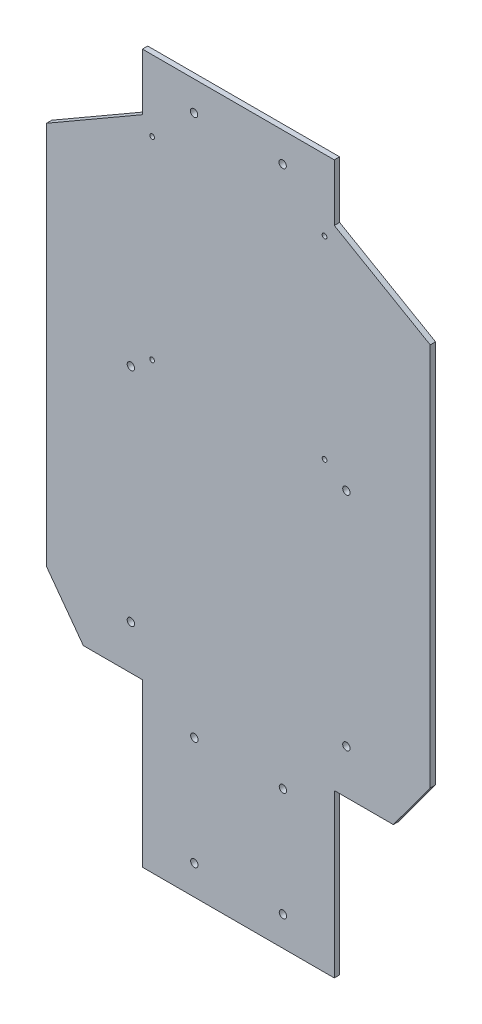
ISO-10303-21;
HEADER;
FILE_DESCRIPTION(('STEP AP214'),'2;1');
FILE_NAME('part.step','',(''),(''),'','','');
FILE_SCHEMA(('AUTOMOTIVE_DESIGN { 1 0 10303 214 1 1 1 1 }'));
ENDSEC;
DATA;
#1=APPLICATION_CONTEXT('core data for automotive mechanical design processes');
#2=APPLICATION_PROTOCOL_DEFINITION('international standard','automotive_design',2000,#1);
#3=PRODUCT_CONTEXT('',#1,'mechanical');
#4=PRODUCT('Part','Part','',(#3));
#5=PRODUCT_RELATED_PRODUCT_CATEGORY('part','',(#4));
#6=PRODUCT_DEFINITION_FORMATION('','',#4);
#7=PRODUCT_DEFINITION_CONTEXT('part definition',#1,'design');
#8=PRODUCT_DEFINITION('design','',#6,#7);
#9=PRODUCT_DEFINITION_SHAPE('','',#8);
#10=(LENGTH_UNIT() NAMED_UNIT(*) SI_UNIT(.MILLI.,.METRE.));
#11=(NAMED_UNIT(*) PLANE_ANGLE_UNIT() SI_UNIT($,.RADIAN.));
#12=(NAMED_UNIT(*) SI_UNIT($,.STERADIAN.) SOLID_ANGLE_UNIT());
#13=UNCERTAINTY_MEASURE_WITH_UNIT(LENGTH_MEASURE(1.E-05),#10,'distance_accuracy_value','');
#14=(GEOMETRIC_REPRESENTATION_CONTEXT(3) GLOBAL_UNCERTAINTY_ASSIGNED_CONTEXT((#13)) GLOBAL_UNIT_ASSIGNED_CONTEXT((#10,
#11,#12)) REPRESENTATION_CONTEXT('',''));
#15=CARTESIAN_POINT('',(0.,0.,0.));
#16=DIRECTION('',(0.,0.,1.));
#17=DIRECTION('',(1.,0.,0.));
#18=AXIS2_PLACEMENT_3D('',#15,#16,#17);
#19=CARTESIAN_POINT('',(-53.975,-171.972117639198,2.286));
#20=DIRECTION('',(-1.,0.,0.));
#21=DIRECTION('',(0.,-1.,0.));
#22=AXIS2_PLACEMENT_3D('',#19,#20,#21);
#23=PLANE('',#22);
#24=DIRECTION('',(0.,1.,0.));
#25=VECTOR('',#24,1.);
#26=CARTESIAN_POINT('',(-53.975,-171.972117639198,0.));
#27=LINE('',#26,#25);
#28=CARTESIAN_POINT('',(-53.975,-171.972117639198,0.));
#29=VERTEX_POINT('',#28);
#30=CARTESIAN_POINT('',(-53.975,-102.122117639198,0.));
#31=VERTEX_POINT('',#30);
#32=EDGE_CURVE('E169',#29,#31,#27,.T.);
#33=ORIENTED_EDGE('',*,*,#32,.F.);
#34=DIRECTION('',(0.,0.,-1.));
#35=VECTOR('',#34,1.);
#36=CARTESIAN_POINT('',(-53.975,-171.972117639198,2.286));
#37=LINE('',#36,#35);
#38=CARTESIAN_POINT('',(-53.975,-171.972117639198,2.286));
#39=VERTEX_POINT('',#38);
#40=EDGE_CURVE('E11',#39,#29,#37,.T.);
#41=ORIENTED_EDGE('',*,*,#40,.F.);
#42=DIRECTION('',(0.,1.,0.));
#43=VECTOR('',#42,1.);
#44=CARTESIAN_POINT('',(-53.975,-171.972117639198,2.286));
#45=LINE('',#44,#43);
#46=CARTESIAN_POINT('',(-53.975,-102.122117639198,2.286));
#47=VERTEX_POINT('',#46);
#48=EDGE_CURVE('E205',#39,#47,#45,.T.);
#49=ORIENTED_EDGE('',*,*,#48,.T.);
#50=DIRECTION('',(0.,0.,-1.));
#51=VECTOR('',#50,1.);
#52=CARTESIAN_POINT('',(-53.975,-102.122117639198,2.286));
#53=LINE('',#52,#51);
#54=EDGE_CURVE('E38',#47,#31,#53,.T.);
#55=ORIENTED_EDGE('',*,*,#54,.T.);
#56=EDGE_LOOP('',(#33,#41,#49,#55));
#57=FACE_BOUND('',#56,.T.);
#58=ADVANCED_FACE('F35',(#57),#23,.T.);
#59=CARTESIAN_POINT('',(-53.975,-171.972117639198,2.286));
#60=DIRECTION('',(0.,1.,0.));
#61=DIRECTION('',(0.,0.,1.));
#62=AXIS2_PLACEMENT_3D('',#59,#60,#61);
#63=PLANE('',#62);
#64=DIRECTION('',(1.,0.,0.));
#65=VECTOR('',#64,1.);
#66=CARTESIAN_POINT('',(-53.975,-171.972117639198,0.));
#67=LINE('',#66,#65);
#68=CARTESIAN_POINT('',(28.5749999999999,-171.972117639198,0.));
#69=VERTEX_POINT('',#68);
#70=EDGE_CURVE('E98',#29,#69,#67,.T.);
#71=ORIENTED_EDGE('',*,*,#70,.T.);
#72=DIRECTION('',(0.,0.,-1.));
#73=VECTOR('',#72,1.);
#74=CARTESIAN_POINT('',(28.5749999999999,-171.972117639198,2.286));
#75=LINE('',#74,#73);
#76=CARTESIAN_POINT('',(28.5749999999999,-171.972117639198,2.286));
#77=VERTEX_POINT('',#76);
#78=EDGE_CURVE('E44',#77,#69,#75,.T.);
#79=ORIENTED_EDGE('',*,*,#78,.F.);
#80=DIRECTION('',(1.,0.,0.));
#81=VECTOR('',#80,1.);
#82=CARTESIAN_POINT('',(-53.975,-171.972117639198,2.286));
#83=LINE('',#82,#81);
#84=EDGE_CURVE('E147',#39,#77,#83,.T.);
#85=ORIENTED_EDGE('',*,*,#84,.F.);
#86=ORIENTED_EDGE('',*,*,#40,.T.);
#87=EDGE_LOOP('',(#71,#79,#85,#86));
#88=FACE_BOUND('',#87,.T.);
#89=ADVANCED_FACE('F387',(#88),#63,.F.);
#90=CARTESIAN_POINT('',(28.5749999999999,-171.972117639198,2.286));
#91=DIRECTION('',(-1.,0.,0.));
#92=DIRECTION('',(0.,-1.,0.));
#93=AXIS2_PLACEMENT_3D('',#90,#91,#92);
#94=PLANE('',#93);
#95=DIRECTION('',(0.,1.,0.));
#96=VECTOR('',#95,1.);
#97=CARTESIAN_POINT('',(28.5749999999999,-171.972117639198,0.));
#98=LINE('',#97,#96);
#99=CARTESIAN_POINT('',(28.5749999999999,-102.122117639198,0.));
#100=VERTEX_POINT('',#99);
#101=EDGE_CURVE('E154',#69,#100,#98,.T.);
#102=ORIENTED_EDGE('',*,*,#101,.T.);
#103=DIRECTION('',(0.,0.,-1.));
#104=VECTOR('',#103,1.);
#105=CARTESIAN_POINT('',(28.5749999999999,-102.122117639198,2.286));
#106=LINE('',#105,#104);
#107=CARTESIAN_POINT('',(28.5749999999999,-102.122117639198,2.286));
#108=VERTEX_POINT('',#107);
#109=EDGE_CURVE('E151',#108,#100,#106,.T.);
#110=ORIENTED_EDGE('',*,*,#109,.F.);
#111=DIRECTION('',(0.,1.,0.));
#112=VECTOR('',#111,1.);
#113=CARTESIAN_POINT('',(28.5749999999999,-171.972117639198,2.286));
#114=LINE('',#113,#112);
#115=EDGE_CURVE('E140',#77,#108,#114,.T.);
#116=ORIENTED_EDGE('',*,*,#115,.F.);
#117=ORIENTED_EDGE('',*,*,#78,.T.);
#118=EDGE_LOOP('',(#102,#110,#116,#117));
#119=FACE_BOUND('',#118,.T.);
#120=ADVANCED_FACE('F152',(#119),#94,.F.);
#121=CARTESIAN_POINT('',(28.5749999999999,-102.122117639198,2.286));
#122=DIRECTION('',(0.,1.,0.));
#123=DIRECTION('',(0.,0.,1.));
#124=AXIS2_PLACEMENT_3D('',#121,#122,#123);
#125=PLANE('',#124);
#126=DIRECTION('',(1.,0.,0.));
#127=VECTOR('',#126,1.);
#128=CARTESIAN_POINT('',(28.5749999999999,-102.122117639198,0.));
#129=LINE('',#128,#127);
#130=CARTESIAN_POINT('',(53.9749999999999,-102.122117639198,0.));
#131=VERTEX_POINT('',#130);
#132=EDGE_CURVE('E202',#100,#131,#129,.T.);
#133=ORIENTED_EDGE('',*,*,#132,.T.);
#134=DIRECTION('',(0.,0.,-1.));
#135=VECTOR('',#134,1.);
#136=CARTESIAN_POINT('',(53.9749999999999,-102.122117639198,2.286));
#137=LINE('',#136,#135);
#138=CARTESIAN_POINT('',(53.9749999999999,-102.122117639198,2.286));
#139=VERTEX_POINT('',#138);
#140=EDGE_CURVE('E157',#139,#131,#137,.T.);
#141=ORIENTED_EDGE('',*,*,#140,.F.);
#142=DIRECTION('',(1.,0.,0.));
#143=VECTOR('',#142,1.);
#144=CARTESIAN_POINT('',(28.5749999999999,-102.122117639198,2.286));
#145=LINE('',#144,#143);
#146=EDGE_CURVE('E145',#108,#139,#145,.T.);
#147=ORIENTED_EDGE('',*,*,#146,.F.);
#148=ORIENTED_EDGE('',*,*,#109,.T.);
#149=EDGE_LOOP('',(#133,#141,#147,#148));
#150=FACE_BOUND('',#149,.T.);
#151=ADVANCED_FACE('F159',(#150),#125,.F.);
#152=CARTESIAN_POINT('',(53.9749999999999,-102.122117639198,2.286));
#153=DIRECTION('',(-0.805419930565665,0.59270459374599,0.));
#154=DIRECTION('',(-0.59270459374599,-0.805419930565666,0.));
#155=AXIS2_PLACEMENT_3D('',#152,#153,#154);
#156=PLANE('',#155);
#157=DIRECTION('',(0.59270459374599,0.805419930565665,0.));
#158=VECTOR('',#157,1.);
#159=CARTESIAN_POINT('',(53.9749999999999,-102.122117639198,0.));
#160=LINE('',#159,#158);
#161=CARTESIAN_POINT('',(69.85,-80.5497500000001,0.));
#162=VERTEX_POINT('',#161);
#163=EDGE_CURVE('E199',#131,#162,#160,.T.);
#164=ORIENTED_EDGE('',*,*,#163,.T.);
#165=DIRECTION('',(0.,0.,-1.));
#166=VECTOR('',#165,1.);
#167=CARTESIAN_POINT('',(69.85,-80.5497500000001,2.286));
#168=LINE('',#167,#166);
#169=CARTESIAN_POINT('',(69.85,-80.5497500000001,2.286));
#170=VERTEX_POINT('',#169);
#171=EDGE_CURVE('E209',#170,#162,#168,.T.);
#172=ORIENTED_EDGE('',*,*,#171,.F.);
#173=DIRECTION('',(0.59270459374599,0.805419930565665,0.));
#174=VECTOR('',#173,1.);
#175=CARTESIAN_POINT('',(53.9749999999999,-102.122117639198,2.286));
#176=LINE('',#175,#174);
#177=EDGE_CURVE('E162',#139,#170,#176,.T.);
#178=ORIENTED_EDGE('',*,*,#177,.F.);
#179=ORIENTED_EDGE('',*,*,#140,.T.);
#180=EDGE_LOOP('',(#164,#172,#178,#179));
#181=FACE_BOUND('',#180,.T.);
#182=ADVANCED_FACE('F233',(#181),#156,.F.);
#183=CARTESIAN_POINT('',(69.85,84.5502499999999,2.286));
#184=DIRECTION('',(1.,0.,0.));
#185=DIRECTION('',(0.,0.,-1.));
#186=AXIS2_PLACEMENT_3D('',#183,#184,#185);
#187=PLANE('',#186);
#188=DIRECTION('',(0.,-1.,0.));
#189=VECTOR('',#188,1.);
#190=CARTESIAN_POINT('',(69.85,84.5502499999999,0.));
#191=LINE('',#190,#189);
#192=CARTESIAN_POINT('',(69.85,84.5502499999999,0.));
#193=VERTEX_POINT('',#192);
#194=EDGE_CURVE('E196',#193,#162,#191,.T.);
#195=ORIENTED_EDGE('',*,*,#194,.F.);
#196=DIRECTION('',(0.,0.,-1.));
#197=VECTOR('',#196,1.);
#198=CARTESIAN_POINT('',(69.85,84.5502499999999,2.286));
#199=LINE('',#198,#197);
#200=CARTESIAN_POINT('',(69.85,84.5502499999999,2.286));
#201=VERTEX_POINT('',#200);
#202=EDGE_CURVE('E211',#201,#193,#199,.T.);
#203=ORIENTED_EDGE('',*,*,#202,.F.);
#204=DIRECTION('',(0.,-1.,0.));
#205=VECTOR('',#204,1.);
#206=CARTESIAN_POINT('',(69.85,84.5502499999999,2.286));
#207=LINE('',#206,#205);
#208=EDGE_CURVE('E164',#201,#170,#207,.T.);
#209=ORIENTED_EDGE('',*,*,#208,.T.);
#210=ORIENTED_EDGE('',*,*,#171,.T.);
#211=EDGE_LOOP('',(#195,#203,#209,#210));
#212=FACE_BOUND('',#211,.T.);
#213=ADVANCED_FACE('F401',(#212),#187,.T.);
#214=CARTESIAN_POINT('',(28.5749999999999,108.380382360802,2.286));
#215=DIRECTION('',(0.500000000000001,0.866025403784438,0.));
#216=DIRECTION('',(-0.866025403784438,0.500000000000001,0.));
#217=AXIS2_PLACEMENT_3D('',#214,#215,#216);
#218=PLANE('',#217);
#219=DIRECTION('',(0.866025403784438,-0.500000000000001,0.));
#220=VECTOR('',#219,1.);
#221=CARTESIAN_POINT('',(28.5749999999999,108.380382360802,0.));
#222=LINE('',#221,#220);
#223=CARTESIAN_POINT('',(28.5749999999999,108.380382360802,0.));
#224=VERTEX_POINT('',#223);
#225=EDGE_CURVE('E193',#224,#193,#222,.T.);
#226=ORIENTED_EDGE('',*,*,#225,.F.);
#227=DIRECTION('',(0.,0.,-1.));
#228=VECTOR('',#227,1.);
#229=CARTESIAN_POINT('',(28.5749999999999,108.380382360802,2.286));
#230=LINE('',#229,#228);
#231=CARTESIAN_POINT('',(28.5749999999999,108.380382360802,2.286));
#232=VERTEX_POINT('',#231);
#233=EDGE_CURVE('E213',#232,#224,#230,.T.);
#234=ORIENTED_EDGE('',*,*,#233,.F.);
#235=DIRECTION('',(0.866025403784438,-0.500000000000001,0.));
#236=VECTOR('',#235,1.);
#237=CARTESIAN_POINT('',(28.5749999999999,108.380382360802,2.286));
#238=LINE('',#237,#236);
#239=EDGE_CURVE('E240',#232,#201,#238,.T.);
#240=ORIENTED_EDGE('',*,*,#239,.T.);
#241=ORIENTED_EDGE('',*,*,#202,.T.);
#242=EDGE_LOOP('',(#226,#234,#240,#241));
#243=FACE_BOUND('',#242,.T.);
#244=ADVANCED_FACE('F245',(#243),#218,.T.);
#245=CARTESIAN_POINT('',(28.5749999999999,132.827882360802,2.286));
#246=DIRECTION('',(1.,0.,0.));
#247=DIRECTION('',(0.,1.,0.));
#248=AXIS2_PLACEMENT_3D('',#245,#246,#247);
#249=PLANE('',#248);
#250=DIRECTION('',(0.,-1.,0.));
#251=VECTOR('',#250,1.);
#252=CARTESIAN_POINT('',(28.5749999999999,132.827882360802,0.));
#253=LINE('',#252,#251);
#254=CARTESIAN_POINT('',(28.5749999999999,132.827882360802,0.));
#255=VERTEX_POINT('',#254);
#256=EDGE_CURVE('E190',#255,#224,#253,.T.);
#257=ORIENTED_EDGE('',*,*,#256,.F.);
#258=DIRECTION('',(0.,0.,-1.));
#259=VECTOR('',#258,1.);
#260=CARTESIAN_POINT('',(28.5749999999999,132.827882360802,2.286));
#261=LINE('',#260,#259);
#262=CARTESIAN_POINT('',(28.5749999999999,132.827882360802,2.286));
#263=VERTEX_POINT('',#262);
#264=EDGE_CURVE('E215',#263,#255,#261,.T.);
#265=ORIENTED_EDGE('',*,*,#264,.F.);
#266=DIRECTION('',(0.,-1.,0.));
#267=VECTOR('',#266,1.);
#268=CARTESIAN_POINT('',(28.5749999999999,132.827882360802,2.286));
#269=LINE('',#268,#267);
#270=EDGE_CURVE('E247',#263,#232,#269,.T.);
#271=ORIENTED_EDGE('',*,*,#270,.T.);
#272=ORIENTED_EDGE('',*,*,#233,.T.);
#273=EDGE_LOOP('',(#257,#265,#271,#272));
#274=FACE_BOUND('',#273,.T.);
#275=ADVANCED_FACE('F406',(#274),#249,.T.);
#276=CARTESIAN_POINT('',(-53.9750000000001,132.827882360802,2.286));
#277=DIRECTION('',(0.,1.,0.));
#278=DIRECTION('',(0.,0.,1.));
#279=AXIS2_PLACEMENT_3D('',#276,#277,#278);
#280=PLANE('',#279);
#281=DIRECTION('',(1.,0.,0.));
#282=VECTOR('',#281,1.);
#283=CARTESIAN_POINT('',(-53.9750000000001,132.827882360802,0.));
#284=LINE('',#283,#282);
#285=CARTESIAN_POINT('',(-53.9750000000001,132.827882360802,0.));
#286=VERTEX_POINT('',#285);
#287=EDGE_CURVE('E187',#286,#255,#284,.T.);
#288=ORIENTED_EDGE('',*,*,#287,.F.);
#289=DIRECTION('',(0.,0.,-1.));
#290=VECTOR('',#289,1.);
#291=CARTESIAN_POINT('',(-53.9750000000001,132.827882360802,2.286));
#292=LINE('',#291,#290);
#293=CARTESIAN_POINT('',(-53.9750000000001,132.827882360802,2.286));
#294=VERTEX_POINT('',#293);
#295=EDGE_CURVE('E217',#294,#286,#292,.T.);
#296=ORIENTED_EDGE('',*,*,#295,.F.);
#297=DIRECTION('',(1.,0.,0.));
#298=VECTOR('',#297,1.);
#299=CARTESIAN_POINT('',(-53.9750000000001,132.827882360802,2.286));
#300=LINE('',#299,#298);
#301=EDGE_CURVE('E249',#294,#263,#300,.T.);
#302=ORIENTED_EDGE('',*,*,#301,.T.);
#303=ORIENTED_EDGE('',*,*,#264,.T.);
#304=EDGE_LOOP('',(#288,#296,#302,#303));
#305=FACE_BOUND('',#304,.T.);
#306=ADVANCED_FACE('F409',(#305),#280,.T.);
#307=CARTESIAN_POINT('',(-53.9750000000001,108.380382360802,2.286));
#308=DIRECTION('',(-1.,0.,0.));
#309=DIRECTION('',(0.,0.,1.));
#310=AXIS2_PLACEMENT_3D('',#307,#308,#309);
#311=PLANE('',#310);
#312=DIRECTION('',(0.,1.,0.));
#313=VECTOR('',#312,1.);
#314=CARTESIAN_POINT('',(-53.9750000000001,108.380382360802,0.));
#315=LINE('',#314,#313);
#316=CARTESIAN_POINT('',(-53.9750000000001,108.380382360802,0.));
#317=VERTEX_POINT('',#316);
#318=EDGE_CURVE('E184',#317,#286,#315,.T.);
#319=ORIENTED_EDGE('',*,*,#318,.F.);
#320=DIRECTION('',(0.,0.,-1.));
#321=VECTOR('',#320,1.);
#322=CARTESIAN_POINT('',(-53.9750000000001,108.380382360802,2.286));
#323=LINE('',#322,#321);
#324=CARTESIAN_POINT('',(-53.9750000000001,108.380382360802,2.286));
#325=VERTEX_POINT('',#324);
#326=EDGE_CURVE('E219',#325,#317,#323,.T.);
#327=ORIENTED_EDGE('',*,*,#326,.F.);
#328=DIRECTION('',(0.,1.,0.));
#329=VECTOR('',#328,1.);
#330=CARTESIAN_POINT('',(-53.9750000000001,108.380382360802,2.286));
#331=LINE('',#330,#329);
#332=EDGE_CURVE('E254',#325,#294,#331,.T.);
#333=ORIENTED_EDGE('',*,*,#332,.T.);
#334=ORIENTED_EDGE('',*,*,#295,.T.);
#335=EDGE_LOOP('',(#319,#327,#333,#334));
#336=FACE_BOUND('',#335,.T.);
#337=ADVANCED_FACE('F413',(#336),#311,.T.);
#338=CARTESIAN_POINT('',(-95.25,84.5502499999999,2.286));
#339=DIRECTION('',(-0.500000000000003,0.866025403784437,0.));
#340=DIRECTION('',(-0.866025403784437,-0.500000000000003,0.));
#341=AXIS2_PLACEMENT_3D('',#338,#339,#340);
#342=PLANE('',#341);
#343=DIRECTION('',(0.866025403784437,0.500000000000003,0.));
#344=VECTOR('',#343,1.);
#345=CARTESIAN_POINT('',(-95.25,84.5502499999999,0.));
#346=LINE('',#345,#344);
#347=CARTESIAN_POINT('',(-95.25,84.5502499999999,0.));
#348=VERTEX_POINT('',#347);
#349=EDGE_CURVE('E181',#348,#317,#346,.T.);
#350=ORIENTED_EDGE('',*,*,#349,.F.);
#351=DIRECTION('',(0.,0.,-1.));
#352=VECTOR('',#351,1.);
#353=CARTESIAN_POINT('',(-95.25,84.5502499999999,2.286));
#354=LINE('',#353,#352);
#355=CARTESIAN_POINT('',(-95.25,84.5502499999999,2.286));
#356=VERTEX_POINT('',#355);
#357=EDGE_CURVE('E221',#356,#348,#354,.T.);
#358=ORIENTED_EDGE('',*,*,#357,.F.);
#359=DIRECTION('',(0.866025403784437,0.500000000000003,0.));
#360=VECTOR('',#359,1.);
#361=CARTESIAN_POINT('',(-95.25,84.5502499999999,2.286));
#362=LINE('',#361,#360);
#363=EDGE_CURVE('E257',#356,#325,#362,.T.);
#364=ORIENTED_EDGE('',*,*,#363,.T.);
#365=ORIENTED_EDGE('',*,*,#326,.T.);
#366=EDGE_LOOP('',(#350,#358,#364,#365));
#367=FACE_BOUND('',#366,.T.);
#368=ADVANCED_FACE('F417',(#367),#342,.T.);
#369=CARTESIAN_POINT('',(-95.25,84.5502499999999,2.286));
#370=DIRECTION('',(1.,0.,0.));
#371=DIRECTION('',(0.,1.,0.));
#372=AXIS2_PLACEMENT_3D('',#369,#370,#371);
#373=PLANE('',#372);
#374=DIRECTION('',(0.,-1.,0.));
#375=VECTOR('',#374,1.);
#376=CARTESIAN_POINT('',(-95.25,84.5502499999999,0.));
#377=LINE('',#376,#375);
#378=CARTESIAN_POINT('',(-95.25,-80.5497500000001,0.));
#379=VERTEX_POINT('',#378);
#380=EDGE_CURVE('E179',#348,#379,#377,.T.);
#381=ORIENTED_EDGE('',*,*,#380,.T.);
#382=DIRECTION('',(0.,0.,-1.));
#383=VECTOR('',#382,1.);
#384=CARTESIAN_POINT('',(-95.25,-80.5497500000001,2.286));
#385=LINE('',#384,#383);
#386=CARTESIAN_POINT('',(-95.25,-80.5497500000001,2.286));
#387=VERTEX_POINT('',#386);
#388=EDGE_CURVE('E223',#387,#379,#385,.T.);
#389=ORIENTED_EDGE('',*,*,#388,.F.);
#390=DIRECTION('',(0.,-1.,0.));
#391=VECTOR('',#390,1.);
#392=CARTESIAN_POINT('',(-95.25,84.5502499999999,2.286));
#393=LINE('',#392,#391);
#394=EDGE_CURVE('E260',#356,#387,#393,.T.);
#395=ORIENTED_EDGE('',*,*,#394,.F.);
#396=ORIENTED_EDGE('',*,*,#357,.T.);
#397=EDGE_LOOP('',(#381,#389,#395,#396));
#398=FACE_BOUND('',#397,.T.);
#399=ADVANCED_FACE('F421',(#398),#373,.F.);
#400=CARTESIAN_POINT('',(-95.25,-80.5497500000001,2.286));
#401=DIRECTION('',(0.805419930565668,0.592704593745986,0.));
#402=DIRECTION('',(-0.592704593745986,0.805419930565668,0.));
#403=AXIS2_PLACEMENT_3D('',#400,#401,#402);
#404=PLANE('',#403);
#405=DIRECTION('',(0.592704593745986,-0.805419930565668,0.));
#406=VECTOR('',#405,1.);
#407=CARTESIAN_POINT('',(-95.25,-80.5497500000001,0.));
#408=LINE('',#407,#406);
#409=CARTESIAN_POINT('',(-79.375,-102.122117639198,0.));
#410=VERTEX_POINT('',#409);
#411=EDGE_CURVE('E176',#379,#410,#408,.T.);
#412=ORIENTED_EDGE('',*,*,#411,.T.);
#413=DIRECTION('',(0.,0.,-1.));
#414=VECTOR('',#413,1.);
#415=CARTESIAN_POINT('',(-79.375,-102.122117639198,2.286));
#416=LINE('',#415,#414);
#417=CARTESIAN_POINT('',(-79.375,-102.122117639198,2.286));
#418=VERTEX_POINT('',#417);
#419=EDGE_CURVE('E225',#418,#410,#416,.T.);
#420=ORIENTED_EDGE('',*,*,#419,.F.);
#421=DIRECTION('',(0.592704593745986,-0.805419930565668,0.));
#422=VECTOR('',#421,1.);
#423=CARTESIAN_POINT('',(-95.25,-80.5497500000001,2.286));
#424=LINE('',#423,#422);
#425=EDGE_CURVE('E262',#387,#418,#424,.T.);
#426=ORIENTED_EDGE('',*,*,#425,.F.);
#427=ORIENTED_EDGE('',*,*,#388,.T.);
#428=EDGE_LOOP('',(#412,#420,#426,#427));
#429=FACE_BOUND('',#428,.T.);
#430=ADVANCED_FACE('F425',(#429),#404,.F.);
#431=CARTESIAN_POINT('',(-53.975,-102.122117639198,2.286));
#432=DIRECTION('',(0.,-1.,0.));
#433=DIRECTION('',(0.,0.,-1.));
#434=AXIS2_PLACEMENT_3D('',#431,#432,#433);
#435=PLANE('',#434);
#436=DIRECTION('',(-1.,0.,0.));
#437=VECTOR('',#436,1.);
#438=CARTESIAN_POINT('',(-53.975,-102.122117639198,0.));
#439=LINE('',#438,#437);
#440=EDGE_CURVE('E172',#31,#410,#439,.T.);
#441=ORIENTED_EDGE('',*,*,#440,.F.);
#442=ORIENTED_EDGE('',*,*,#54,.F.);
#443=DIRECTION('',(-1.,0.,0.));
#444=VECTOR('',#443,1.);
#445=CARTESIAN_POINT('',(-53.975,-102.122117639198,2.286));
#446=LINE('',#445,#444);
#447=EDGE_CURVE('E264',#47,#418,#446,.T.);
#448=ORIENTED_EDGE('',*,*,#447,.T.);
#449=ORIENTED_EDGE('',*,*,#419,.T.);
#450=EDGE_LOOP('',(#441,#442,#448,#449));
#451=FACE_BOUND('',#450,.T.);
#452=ADVANCED_FACE('F227',(#451),#435,.T.);
#453=CARTESIAN_POINT('',(0.,0.,2.286));
#454=DIRECTION('',(0.,0.,1.));
#455=DIRECTION('',(1.,0.,0.));
#456=AXIS2_PLACEMENT_3D('',#453,#454,#455);
#457=PLANE('',#456);
#458=CARTESIAN_POINT('',(24.3839999999999,19.1628823608019,2.286));
#459=DIRECTION('',(0.,0.,1.));
#460=DIRECTION('',(1.,0.,0.));
#461=AXIS2_PLACEMENT_3D('',#458,#459,#460);
#462=CIRCLE('',#461,1.016);
#463=CARTESIAN_POINT('',(25.3999999999999,19.1628823608019,2.286));
#464=VERTEX_POINT('',#463);
#465=EDGE_CURVE('E313',#464,#464,#462,.T.);
#466=ORIENTED_EDGE('',*,*,#465,.F.);
#467=EDGE_LOOP('',(#466));
#468=FACE_BOUND('',#467,.T.);
#469=CARTESIAN_POINT('',(-49.7840000000001,19.1628823608019,2.286));
#470=DIRECTION('',(0.,0.,1.));
#471=DIRECTION('',(1.,0.,0.));
#472=AXIS2_PLACEMENT_3D('',#469,#470,#471);
#473=CIRCLE('',#472,1.016);
#474=CARTESIAN_POINT('',(-48.7680000000001,19.1628823608019,2.286));
#475=VERTEX_POINT('',#474);
#476=EDGE_CURVE('E312',#475,#475,#473,.T.);
#477=ORIENTED_EDGE('',*,*,#476,.F.);
#478=EDGE_LOOP('',(#477));
#479=FACE_BOUND('',#478,.T.);
#480=CARTESIAN_POINT('',(24.3839999999999,102.347882360802,2.286));
#481=DIRECTION('',(0.,0.,1.));
#482=DIRECTION('',(1.,0.,0.));
#483=AXIS2_PLACEMENT_3D('',#480,#481,#482);
#484=CIRCLE('',#483,1.016);
#485=CARTESIAN_POINT('',(25.3999999999999,102.347882360802,2.286));
#486=VERTEX_POINT('',#485);
#487=EDGE_CURVE('E319',#486,#486,#484,.T.);
#488=ORIENTED_EDGE('',*,*,#487,.F.);
#489=EDGE_LOOP('',(#488));
#490=FACE_BOUND('',#489,.T.);
#491=CARTESIAN_POINT('',(-49.7840000000001,102.347882360802,2.286));
#492=DIRECTION('',(0.,0.,1.));
#493=DIRECTION('',(1.,0.,0.));
#494=AXIS2_PLACEMENT_3D('',#491,#492,#493);
#495=CIRCLE('',#494,1.016);
#496=CARTESIAN_POINT('',(-48.7680000000001,102.347882360802,2.286));
#497=VERTEX_POINT('',#496);
#498=EDGE_CURVE('E325',#497,#497,#495,.T.);
#499=ORIENTED_EDGE('',*,*,#498,.F.);
#500=EDGE_LOOP('',(#499));
#501=FACE_BOUND('',#500,.T.);
#502=CARTESIAN_POINT('',(33.782,12.1778823608018,2.286));
#503=DIRECTION('',(0.,0.,1.));
#504=DIRECTION('',(1.,0.,0.));
#505=AXIS2_PLACEMENT_3D('',#502,#503,#504);
#506=CIRCLE('',#505,1.5875);
#507=CARTESIAN_POINT('',(35.3695,12.1778823608018,2.286));
#508=VERTEX_POINT('',#507);
#509=EDGE_CURVE('E331',#508,#508,#506,.T.);
#510=ORIENTED_EDGE('',*,*,#509,.F.);
#511=EDGE_LOOP('',(#510));
#512=FACE_BOUND('',#511,.T.);
#513=CARTESIAN_POINT('',(-58.928,12.1778823608018,2.286));
#514=DIRECTION('',(0.,0.,1.));
#515=DIRECTION('',(1.,0.,0.));
#516=AXIS2_PLACEMENT_3D('',#513,#514,#515);
#517=CIRCLE('',#516,1.5875);
#518=CARTESIAN_POINT('',(-57.3405,12.1778823608018,2.286));
#519=VERTEX_POINT('',#518);
#520=EDGE_CURVE('E337',#519,#519,#517,.T.);
#521=ORIENTED_EDGE('',*,*,#520,.F.);
#522=EDGE_LOOP('',(#521));
#523=FACE_BOUND('',#522,.T.);
#524=CARTESIAN_POINT('',(33.782,-83.0721176391982,2.286));
#525=DIRECTION('',(0.,0.,1.));
#526=DIRECTION('',(1.,0.,0.));
#527=AXIS2_PLACEMENT_3D('',#524,#525,#526);
#528=CIRCLE('',#527,1.5875);
#529=CARTESIAN_POINT('',(35.3695,-83.0721176391982,2.286));
#530=VERTEX_POINT('',#529);
#531=EDGE_CURVE('E343',#530,#530,#528,.T.);
#532=ORIENTED_EDGE('',*,*,#531,.F.);
#533=EDGE_LOOP('',(#532));
#534=FACE_BOUND('',#533,.T.);
#535=CARTESIAN_POINT('',(6.47699999999998,-159.272117639198,2.286));
#536=DIRECTION('',(0.,0.,1.));
#537=DIRECTION('',(1.,0.,0.));
#538=AXIS2_PLACEMENT_3D('',#535,#536,#537);
#539=CIRCLE('',#538,1.5875);
#540=CARTESIAN_POINT('',(8.06449999999997,-159.272117639198,2.286));
#541=VERTEX_POINT('',#540);
#542=EDGE_CURVE('E284',#541,#541,#539,.T.);
#543=ORIENTED_EDGE('',*,*,#542,.F.);
#544=EDGE_LOOP('',(#543));
#545=FACE_BOUND('',#544,.T.);
#546=CARTESIAN_POINT('',(-31.623,-112.536117639198,2.286));
#547=DIRECTION('',(0.,0.,1.));
#548=DIRECTION('',(1.,0.,0.));
#549=AXIS2_PLACEMENT_3D('',#546,#547,#548);
#550=CIRCLE('',#549,1.5875);
#551=CARTESIAN_POINT('',(-30.0355,-112.536117639198,2.286));
#552=VERTEX_POINT('',#551);
#553=EDGE_CURVE('E276',#552,#552,#550,.T.);
#554=ORIENTED_EDGE('',*,*,#553,.F.);
#555=EDGE_LOOP('',(#554));
#556=FACE_BOUND('',#555,.T.);
#557=CARTESIAN_POINT('',(-31.7500000000001,120.127882360802,2.286));
#558=DIRECTION('',(0.,0.,1.));
#559=DIRECTION('',(1.,0.,0.));
#560=AXIS2_PLACEMENT_3D('',#557,#558,#559);
#561=CIRCLE('',#560,1.5875);
#562=CARTESIAN_POINT('',(-30.1625000000001,120.127882360802,2.286));
#563=VERTEX_POINT('',#562);
#564=EDGE_CURVE('E277',#563,#563,#561,.T.);
#565=ORIENTED_EDGE('',*,*,#564,.F.);
#566=EDGE_LOOP('',(#565));
#567=FACE_BOUND('',#566,.T.);
#568=CARTESIAN_POINT('',(6.34999999999993,120.127882360802,2.286));
#569=DIRECTION('',(0.,0.,1.));
#570=DIRECTION('',(1.,0.,0.));
#571=AXIS2_PLACEMENT_3D('',#568,#569,#570);
#572=CIRCLE('',#571,1.5875);
#573=CARTESIAN_POINT('',(7.93749999999993,120.127882360802,2.286));
#574=VERTEX_POINT('',#573);
#575=EDGE_CURVE('E302',#574,#574,#572,.T.);
#576=ORIENTED_EDGE('',*,*,#575,.F.);
#577=EDGE_LOOP('',(#576));
#578=FACE_BOUND('',#577,.T.);
#579=CARTESIAN_POINT('',(6.47699999999999,-112.536117639198,2.286));
#580=DIRECTION('',(0.,0.,1.));
#581=DIRECTION('',(1.,0.,0.));
#582=AXIS2_PLACEMENT_3D('',#579,#580,#581);
#583=CIRCLE('',#582,1.5875);
#584=CARTESIAN_POINT('',(8.06449999999999,-112.536117639198,2.286));
#585=VERTEX_POINT('',#584);
#586=EDGE_CURVE('E294',#585,#585,#583,.T.);
#587=ORIENTED_EDGE('',*,*,#586,.F.);
#588=EDGE_LOOP('',(#587));
#589=FACE_BOUND('',#588,.T.);
#590=CARTESIAN_POINT('',(-58.928,-83.0721176391982,2.286));
#591=DIRECTION('',(0.,0.,1.));
#592=DIRECTION('',(1.,0.,0.));
#593=AXIS2_PLACEMENT_3D('',#590,#591,#592);
#594=CIRCLE('',#593,1.5875);
#595=CARTESIAN_POINT('',(-57.3405,-83.0721176391982,2.286));
#596=VERTEX_POINT('',#595);
#597=EDGE_CURVE('E295',#596,#596,#594,.T.);
#598=ORIENTED_EDGE('',*,*,#597,.F.);
#599=EDGE_LOOP('',(#598));
#600=FACE_BOUND('',#599,.T.);
#601=CARTESIAN_POINT('',(-31.623,-159.272117639198,2.286));
#602=DIRECTION('',(0.,0.,1.));
#603=DIRECTION('',(1.,0.,0.));
#604=AXIS2_PLACEMENT_3D('',#601,#602,#603);
#605=CIRCLE('',#604,1.5875);
#606=CARTESIAN_POINT('',(-30.0355,-159.272117639198,2.286));
#607=VERTEX_POINT('',#606);
#608=EDGE_CURVE('E269',#607,#607,#605,.T.);
#609=ORIENTED_EDGE('',*,*,#608,.F.);
#610=EDGE_LOOP('',(#609));
#611=FACE_BOUND('',#610,.T.);
#612=ORIENTED_EDGE('',*,*,#48,.F.);
#613=ORIENTED_EDGE('',*,*,#84,.T.);
#614=ORIENTED_EDGE('',*,*,#115,.T.);
#615=ORIENTED_EDGE('',*,*,#146,.T.);
#616=ORIENTED_EDGE('',*,*,#177,.T.);
#617=ORIENTED_EDGE('',*,*,#208,.F.);
#618=ORIENTED_EDGE('',*,*,#239,.F.);
#619=ORIENTED_EDGE('',*,*,#270,.F.);
#620=ORIENTED_EDGE('',*,*,#301,.F.);
#621=ORIENTED_EDGE('',*,*,#332,.F.);
#622=ORIENTED_EDGE('',*,*,#363,.F.);
#623=ORIENTED_EDGE('',*,*,#394,.T.);
#624=ORIENTED_EDGE('',*,*,#425,.T.);
#625=ORIENTED_EDGE('',*,*,#447,.F.);
#626=EDGE_LOOP('',(#612,#613,#614,#615,#616,#617,#618,#619,#620,#621,#622,#623,#624,#625));
#627=FACE_BOUND('',#626,.T.);
#628=ADVANCED_FACE('F143',(#468,#479,#490,#501,#512,#523,#534,#545,#556,#567,#578,#589,#600,
#611,#627),#457,.T.);
#629=CARTESIAN_POINT('',(0.,0.,0.));
#630=DIRECTION('',(0.,0.,1.));
#631=DIRECTION('',(1.,0.,0.));
#632=AXIS2_PLACEMENT_3D('',#629,#630,#631);
#633=PLANE('',#632);
#634=CARTESIAN_POINT('',(24.3839999999999,19.1628823608019,0.));
#635=DIRECTION('',(0.,0.,1.));
#636=DIRECTION('',(1.,0.,0.));
#637=AXIS2_PLACEMENT_3D('',#634,#635,#636);
#638=CIRCLE('',#637,1.016);
#639=CARTESIAN_POINT('',(25.3999999999999,19.1628823608019,0.));
#640=VERTEX_POINT('',#639);
#641=EDGE_CURVE('E309',#640,#640,#638,.F.);
#642=ORIENTED_EDGE('',*,*,#641,.F.);
#643=EDGE_LOOP('',(#642));
#644=FACE_BOUND('',#643,.T.);
#645=CARTESIAN_POINT('',(-49.7840000000001,19.1628823608019,0.));
#646=DIRECTION('',(0.,0.,1.));
#647=DIRECTION('',(1.,0.,0.));
#648=AXIS2_PLACEMENT_3D('',#645,#646,#647);
#649=CIRCLE('',#648,1.016);
#650=CARTESIAN_POINT('',(-48.7680000000001,19.1628823608019,0.));
#651=VERTEX_POINT('',#650);
#652=EDGE_CURVE('E316',#651,#651,#649,.F.);
#653=ORIENTED_EDGE('',*,*,#652,.F.);
#654=EDGE_LOOP('',(#653));
#655=FACE_BOUND('',#654,.T.);
#656=CARTESIAN_POINT('',(24.3839999999999,102.347882360802,0.));
#657=DIRECTION('',(0.,0.,1.));
#658=DIRECTION('',(1.,0.,0.));
#659=AXIS2_PLACEMENT_3D('',#656,#657,#658);
#660=CIRCLE('',#659,1.016);
#661=CARTESIAN_POINT('',(25.3999999999999,102.347882360802,0.));
#662=VERTEX_POINT('',#661);
#663=EDGE_CURVE('E322',#662,#662,#660,.F.);
#664=ORIENTED_EDGE('',*,*,#663,.F.);
#665=EDGE_LOOP('',(#664));
#666=FACE_BOUND('',#665,.T.);
#667=CARTESIAN_POINT('',(-49.7840000000001,102.347882360802,0.));
#668=DIRECTION('',(0.,0.,1.));
#669=DIRECTION('',(1.,0.,0.));
#670=AXIS2_PLACEMENT_3D('',#667,#668,#669);
#671=CIRCLE('',#670,1.016);
#672=CARTESIAN_POINT('',(-48.7680000000001,102.347882360802,0.));
#673=VERTEX_POINT('',#672);
#674=EDGE_CURVE('E328',#673,#673,#671,.F.);
#675=ORIENTED_EDGE('',*,*,#674,.F.);
#676=EDGE_LOOP('',(#675));
#677=FACE_BOUND('',#676,.T.);
#678=CARTESIAN_POINT('',(33.782,12.1778823608018,0.));
#679=DIRECTION('',(0.,0.,1.));
#680=DIRECTION('',(1.,0.,0.));
#681=AXIS2_PLACEMENT_3D('',#678,#679,#680);
#682=CIRCLE('',#681,1.5875);
#683=CARTESIAN_POINT('',(35.3695,12.1778823608018,0.));
#684=VERTEX_POINT('',#683);
#685=EDGE_CURVE('E334',#684,#684,#682,.F.);
#686=ORIENTED_EDGE('',*,*,#685,.F.);
#687=EDGE_LOOP('',(#686));
#688=FACE_BOUND('',#687,.T.);
#689=CARTESIAN_POINT('',(-58.928,12.1778823608018,0.));
#690=DIRECTION('',(0.,0.,1.));
#691=DIRECTION('',(1.,0.,0.));
#692=AXIS2_PLACEMENT_3D('',#689,#690,#691);
#693=CIRCLE('',#692,1.5875);
#694=CARTESIAN_POINT('',(-57.3405,12.1778823608018,0.));
#695=VERTEX_POINT('',#694);
#696=EDGE_CURVE('E340',#695,#695,#693,.F.);
#697=ORIENTED_EDGE('',*,*,#696,.F.);
#698=EDGE_LOOP('',(#697));
#699=FACE_BOUND('',#698,.T.);
#700=CARTESIAN_POINT('',(33.782,-83.0721176391982,0.));
#701=DIRECTION('',(0.,0.,1.));
#702=DIRECTION('',(1.,0.,0.));
#703=AXIS2_PLACEMENT_3D('',#700,#701,#702);
#704=CIRCLE('',#703,1.5875);
#705=CARTESIAN_POINT('',(35.3695,-83.0721176391982,0.));
#706=VERTEX_POINT('',#705);
#707=EDGE_CURVE('E298',#706,#706,#704,.F.);
#708=ORIENTED_EDGE('',*,*,#707,.F.);
#709=EDGE_LOOP('',(#708));
#710=FACE_BOUND('',#709,.T.);
#711=CARTESIAN_POINT('',(6.47699999999998,-159.272117639198,0.));
#712=DIRECTION('',(0.,0.,1.));
#713=DIRECTION('',(1.,0.,0.));
#714=AXIS2_PLACEMENT_3D('',#711,#712,#713);
#715=CIRCLE('',#714,1.5875);
#716=CARTESIAN_POINT('',(8.06449999999997,-159.272117639198,0.));
#717=VERTEX_POINT('',#716);
#718=EDGE_CURVE('E272',#717,#717,#715,.F.);
#719=ORIENTED_EDGE('',*,*,#718,.F.);
#720=EDGE_LOOP('',(#719));
#721=FACE_BOUND('',#720,.T.);
#722=CARTESIAN_POINT('',(-31.623,-112.536117639198,0.));
#723=DIRECTION('',(0.,0.,1.));
#724=DIRECTION('',(1.,0.,0.));
#725=AXIS2_PLACEMENT_3D('',#722,#723,#724);
#726=CIRCLE('',#725,1.5875);
#727=CARTESIAN_POINT('',(-30.0355,-112.536117639198,0.));
#728=VERTEX_POINT('',#727);
#729=EDGE_CURVE('E281',#728,#728,#726,.F.);
#730=ORIENTED_EDGE('',*,*,#729,.F.);
#731=EDGE_LOOP('',(#730));
#732=FACE_BOUND('',#731,.T.);
#733=CARTESIAN_POINT('',(-31.7500000000001,120.127882360802,0.));
#734=DIRECTION('',(0.,0.,1.));
#735=DIRECTION('',(1.,0.,0.));
#736=AXIS2_PLACEMENT_3D('',#733,#734,#735);
#737=CIRCLE('',#736,1.5875);
#738=CARTESIAN_POINT('',(-30.1625000000001,120.127882360802,0.));
#739=VERTEX_POINT('',#738);
#740=EDGE_CURVE('E273',#739,#739,#737,.F.);
#741=ORIENTED_EDGE('',*,*,#740,.F.);
#742=EDGE_LOOP('',(#741));
#743=FACE_BOUND('',#742,.T.);
#744=CARTESIAN_POINT('',(6.34999999999993,120.127882360802,0.));
#745=DIRECTION('',(0.,0.,1.));
#746=DIRECTION('',(1.,0.,0.));
#747=AXIS2_PLACEMENT_3D('',#744,#745,#746);
#748=CIRCLE('',#747,1.5875);
#749=CARTESIAN_POINT('',(7.93749999999993,120.127882360802,0.));
#750=VERTEX_POINT('',#749);
#751=EDGE_CURVE('E280',#750,#750,#748,.F.);
#752=ORIENTED_EDGE('',*,*,#751,.F.);
#753=EDGE_LOOP('',(#752));
#754=FACE_BOUND('',#753,.T.);
#755=CARTESIAN_POINT('',(6.47699999999999,-112.536117639198,0.));
#756=DIRECTION('',(0.,0.,1.));
#757=DIRECTION('',(1.,0.,0.));
#758=AXIS2_PLACEMENT_3D('',#755,#756,#757);
#759=CIRCLE('',#758,1.5875);
#760=CARTESIAN_POINT('',(8.06449999999999,-112.536117639198,0.));
#761=VERTEX_POINT('',#760);
#762=EDGE_CURVE('E299',#761,#761,#759,.F.);
#763=ORIENTED_EDGE('',*,*,#762,.F.);
#764=EDGE_LOOP('',(#763));
#765=FACE_BOUND('',#764,.T.);
#766=CARTESIAN_POINT('',(-58.928,-83.0721176391982,0.));
#767=DIRECTION('',(0.,0.,1.));
#768=DIRECTION('',(1.,0.,0.));
#769=AXIS2_PLACEMENT_3D('',#766,#767,#768);
#770=CIRCLE('',#769,1.5875);
#771=CARTESIAN_POINT('',(-57.3405,-83.0721176391982,0.));
#772=VERTEX_POINT('',#771);
#773=EDGE_CURVE('E291',#772,#772,#770,.F.);
#774=ORIENTED_EDGE('',*,*,#773,.F.);
#775=EDGE_LOOP('',(#774));
#776=FACE_BOUND('',#775,.T.);
#777=CARTESIAN_POINT('',(-31.623,-159.272117639198,0.));
#778=DIRECTION('',(0.,0.,1.));
#779=DIRECTION('',(1.,0.,0.));
#780=AXIS2_PLACEMENT_3D('',#777,#778,#779);
#781=CIRCLE('',#780,1.5875);
#782=CARTESIAN_POINT('',(-30.0355,-159.272117639198,0.));
#783=VERTEX_POINT('',#782);
#784=EDGE_CURVE('E173',#783,#783,#781,.F.);
#785=ORIENTED_EDGE('',*,*,#784,.F.);
#786=EDGE_LOOP('',(#785));
#787=FACE_BOUND('',#786,.T.);
#788=ORIENTED_EDGE('',*,*,#32,.T.);
#789=ORIENTED_EDGE('',*,*,#440,.T.);
#790=ORIENTED_EDGE('',*,*,#411,.F.);
#791=ORIENTED_EDGE('',*,*,#380,.F.);
#792=ORIENTED_EDGE('',*,*,#349,.T.);
#793=ORIENTED_EDGE('',*,*,#318,.T.);
#794=ORIENTED_EDGE('',*,*,#287,.T.);
#795=ORIENTED_EDGE('',*,*,#256,.T.);
#796=ORIENTED_EDGE('',*,*,#225,.T.);
#797=ORIENTED_EDGE('',*,*,#194,.T.);
#798=ORIENTED_EDGE('',*,*,#163,.F.);
#799=ORIENTED_EDGE('',*,*,#132,.F.);
#800=ORIENTED_EDGE('',*,*,#101,.F.);
#801=ORIENTED_EDGE('',*,*,#70,.F.);
#802=EDGE_LOOP('',(#788,#789,#790,#791,#792,#793,#794,#795,#796,#797,#798,#799,#800,#801));
#803=FACE_BOUND('',#802,.T.);
#804=ADVANCED_FACE('F230',(#644,#655,#666,#677,#688,#699,#710,#721,#732,#743,#754,#765,#776,
#787,#803),#633,.F.);
#805=CARTESIAN_POINT('',(-31.623,-159.272117639198,-4.49012806053459));
#806=DIRECTION('',(0.,0.,1.));
#807=DIRECTION('',(1.,0.,0.));
#808=AXIS2_PLACEMENT_3D('',#805,#806,#807);
#809=CYLINDRICAL_SURFACE('',#808,1.5875);
#810=ORIENTED_EDGE('',*,*,#784,.T.);
#811=EDGE_LOOP('',(#810));
#812=FACE_BOUND('',#811,.T.);
#813=ORIENTED_EDGE('',*,*,#608,.T.);
#814=EDGE_LOOP('',(#813));
#815=FACE_BOUND('',#814,.T.);
#816=ADVANCED_FACE('F371',(#812,#815),#809,.F.);
#817=CARTESIAN_POINT('',(-58.928,-83.0721176391982,-4.49012806053459));
#818=DIRECTION('',(0.,0.,1.));
#819=DIRECTION('',(1.,0.,0.));
#820=AXIS2_PLACEMENT_3D('',#817,#818,#819);
#821=CYLINDRICAL_SURFACE('',#820,1.5875);
#822=ORIENTED_EDGE('',*,*,#773,.T.);
#823=EDGE_LOOP('',(#822));
#824=FACE_BOUND('',#823,.T.);
#825=ORIENTED_EDGE('',*,*,#597,.T.);
#826=EDGE_LOOP('',(#825));
#827=FACE_BOUND('',#826,.T.);
#828=ADVANCED_FACE('F373',(#824,#827),#821,.F.);
#829=CARTESIAN_POINT('',(6.47699999999999,-112.536117639198,-4.49012806053459));
#830=DIRECTION('',(0.,0.,1.));
#831=DIRECTION('',(1.,0.,0.));
#832=AXIS2_PLACEMENT_3D('',#829,#830,#831);
#833=CYLINDRICAL_SURFACE('',#832,1.5875);
#834=ORIENTED_EDGE('',*,*,#762,.T.);
#835=EDGE_LOOP('',(#834));
#836=FACE_BOUND('',#835,.T.);
#837=ORIENTED_EDGE('',*,*,#586,.T.);
#838=EDGE_LOOP('',(#837));
#839=FACE_BOUND('',#838,.T.);
#840=ADVANCED_FACE('F380',(#836,#839),#833,.F.);
#841=CARTESIAN_POINT('',(6.34999999999993,120.127882360802,-4.49012806053459));
#842=DIRECTION('',(0.,0.,1.));
#843=DIRECTION('',(1.,0.,0.));
#844=AXIS2_PLACEMENT_3D('',#841,#842,#843);
#845=CYLINDRICAL_SURFACE('',#844,1.5875);
#846=ORIENTED_EDGE('',*,*,#751,.T.);
#847=EDGE_LOOP('',(#846));
#848=FACE_BOUND('',#847,.T.);
#849=ORIENTED_EDGE('',*,*,#575,.T.);
#850=EDGE_LOOP('',(#849));
#851=FACE_BOUND('',#850,.T.);
#852=ADVANCED_FACE('F461',(#848,#851),#845,.F.);
#853=CARTESIAN_POINT('',(-31.7500000000001,120.127882360802,-4.49012806053459));
#854=DIRECTION('',(0.,0.,1.));
#855=DIRECTION('',(1.,0.,0.));
#856=AXIS2_PLACEMENT_3D('',#853,#854,#855);
#857=CYLINDRICAL_SURFACE('',#856,1.5875);
#858=ORIENTED_EDGE('',*,*,#740,.T.);
#859=EDGE_LOOP('',(#858));
#860=FACE_BOUND('',#859,.T.);
#861=ORIENTED_EDGE('',*,*,#564,.T.);
#862=EDGE_LOOP('',(#861));
#863=FACE_BOUND('',#862,.T.);
#864=ADVANCED_FACE('F471',(#860,#863),#857,.F.);
#865=CARTESIAN_POINT('',(-31.623,-112.536117639198,-4.49012806053459));
#866=DIRECTION('',(0.,0.,1.));
#867=DIRECTION('',(1.,0.,0.));
#868=AXIS2_PLACEMENT_3D('',#865,#866,#867);
#869=CYLINDRICAL_SURFACE('',#868,1.5875);
#870=ORIENTED_EDGE('',*,*,#729,.T.);
#871=EDGE_LOOP('',(#870));
#872=FACE_BOUND('',#871,.T.);
#873=ORIENTED_EDGE('',*,*,#553,.T.);
#874=EDGE_LOOP('',(#873));
#875=FACE_BOUND('',#874,.T.);
#876=ADVANCED_FACE('F481',(#872,#875),#869,.F.);
#877=CARTESIAN_POINT('',(6.47699999999998,-159.272117639198,-4.49012806053459));
#878=DIRECTION('',(0.,0.,1.));
#879=DIRECTION('',(1.,0.,0.));
#880=AXIS2_PLACEMENT_3D('',#877,#878,#879);
#881=CYLINDRICAL_SURFACE('',#880,1.5875);
#882=ORIENTED_EDGE('',*,*,#718,.T.);
#883=EDGE_LOOP('',(#882));
#884=FACE_BOUND('',#883,.T.);
#885=ORIENTED_EDGE('',*,*,#542,.T.);
#886=EDGE_LOOP('',(#885));
#887=FACE_BOUND('',#886,.T.);
#888=ADVANCED_FACE('F490',(#884,#887),#881,.F.);
#889=CARTESIAN_POINT('',(33.782,-83.0721176391982,-4.49012806053459));
#890=DIRECTION('',(0.,0.,1.));
#891=DIRECTION('',(1.,0.,0.));
#892=AXIS2_PLACEMENT_3D('',#889,#890,#891);
#893=CYLINDRICAL_SURFACE('',#892,1.5875);
#894=ORIENTED_EDGE('',*,*,#707,.T.);
#895=EDGE_LOOP('',(#894));
#896=FACE_BOUND('',#895,.T.);
#897=ORIENTED_EDGE('',*,*,#531,.T.);
#898=EDGE_LOOP('',(#897));
#899=FACE_BOUND('',#898,.T.);
#900=ADVANCED_FACE('F351',(#896,#899),#893,.F.);
#901=CARTESIAN_POINT('',(-58.928,12.1778823608018,-4.49012806053459));
#902=DIRECTION('',(0.,0.,1.));
#903=DIRECTION('',(1.,0.,0.));
#904=AXIS2_PLACEMENT_3D('',#901,#902,#903);
#905=CYLINDRICAL_SURFACE('',#904,1.5875);
#906=ORIENTED_EDGE('',*,*,#696,.T.);
#907=EDGE_LOOP('',(#906));
#908=FACE_BOUND('',#907,.T.);
#909=ORIENTED_EDGE('',*,*,#520,.T.);
#910=EDGE_LOOP('',(#909));
#911=FACE_BOUND('',#910,.T.);
#912=ADVANCED_FACE('F509',(#908,#911),#905,.F.);
#913=CARTESIAN_POINT('',(33.782,12.1778823608018,-4.49012806053459));
#914=DIRECTION('',(0.,0.,1.));
#915=DIRECTION('',(1.,0.,0.));
#916=AXIS2_PLACEMENT_3D('',#913,#914,#915);
#917=CYLINDRICAL_SURFACE('',#916,1.5875);
#918=ORIENTED_EDGE('',*,*,#685,.T.);
#919=EDGE_LOOP('',(#918));
#920=FACE_BOUND('',#919,.T.);
#921=ORIENTED_EDGE('',*,*,#509,.T.);
#922=EDGE_LOOP('',(#921));
#923=FACE_BOUND('',#922,.T.);
#924=ADVANCED_FACE('F519',(#920,#923),#917,.F.);
#925=CARTESIAN_POINT('',(-49.7840000000001,102.347882360802,-4.49012806053459));
#926=DIRECTION('',(0.,0.,1.));
#927=DIRECTION('',(1.,0.,0.));
#928=AXIS2_PLACEMENT_3D('',#925,#926,#927);
#929=CYLINDRICAL_SURFACE('',#928,1.016);
#930=ORIENTED_EDGE('',*,*,#674,.T.);
#931=EDGE_LOOP('',(#930));
#932=FACE_BOUND('',#931,.T.);
#933=ORIENTED_EDGE('',*,*,#498,.T.);
#934=EDGE_LOOP('',(#933));
#935=FACE_BOUND('',#934,.T.);
#936=ADVANCED_FACE('F529',(#932,#935),#929,.F.);
#937=CARTESIAN_POINT('',(24.3839999999999,102.347882360802,-4.49012806053459));
#938=DIRECTION('',(0.,0.,1.));
#939=DIRECTION('',(1.,0.,0.));
#940=AXIS2_PLACEMENT_3D('',#937,#938,#939);
#941=CYLINDRICAL_SURFACE('',#940,1.016);
#942=ORIENTED_EDGE('',*,*,#663,.T.);
#943=EDGE_LOOP('',(#942));
#944=FACE_BOUND('',#943,.T.);
#945=ORIENTED_EDGE('',*,*,#487,.T.);
#946=EDGE_LOOP('',(#945));
#947=FACE_BOUND('',#946,.T.);
#948=ADVANCED_FACE('F539',(#944,#947),#941,.F.);
#949=CARTESIAN_POINT('',(-49.7840000000001,19.1628823608019,-4.49012806053459));
#950=DIRECTION('',(0.,0.,1.));
#951=DIRECTION('',(1.,0.,0.));
#952=AXIS2_PLACEMENT_3D('',#949,#950,#951);
#953=CYLINDRICAL_SURFACE('',#952,1.016);
#954=ORIENTED_EDGE('',*,*,#652,.T.);
#955=EDGE_LOOP('',(#954));
#956=FACE_BOUND('',#955,.T.);
#957=ORIENTED_EDGE('',*,*,#476,.T.);
#958=EDGE_LOOP('',(#957));
#959=FACE_BOUND('',#958,.T.);
#960=ADVANCED_FACE('F549',(#956,#959),#953,.F.);
#961=CARTESIAN_POINT('',(24.3839999999999,19.1628823608019,-4.49012806053459));
#962=DIRECTION('',(0.,0.,1.));
#963=DIRECTION('',(1.,0.,0.));
#964=AXIS2_PLACEMENT_3D('',#961,#962,#963);
#965=CYLINDRICAL_SURFACE('',#964,1.016);
#966=ORIENTED_EDGE('',*,*,#641,.T.);
#967=EDGE_LOOP('',(#966));
#968=FACE_BOUND('',#967,.T.);
#969=ORIENTED_EDGE('',*,*,#465,.T.);
#970=EDGE_LOOP('',(#969));
#971=FACE_BOUND('',#970,.T.);
#972=ADVANCED_FACE('F559',(#968,#971),#965,.F.);
#973=CLOSED_SHELL('',(#58,#89,#120,#151,#182,#213,#244,#275,#306,#337,#368,#399,#430,#452,#628,
#804,#816,#828,#840,#852,#864,#876,#888,#900,#912,#924,#936,#948,#960,#972));
#974=MANIFOLD_SOLID_BREP('B2',#973);
#975=ADVANCED_BREP_SHAPE_REPRESENTATION('',(#18,#974),#14);
#976=SHAPE_DEFINITION_REPRESENTATION(#9,#975);
ENDSEC;
END-ISO-10303-21;
